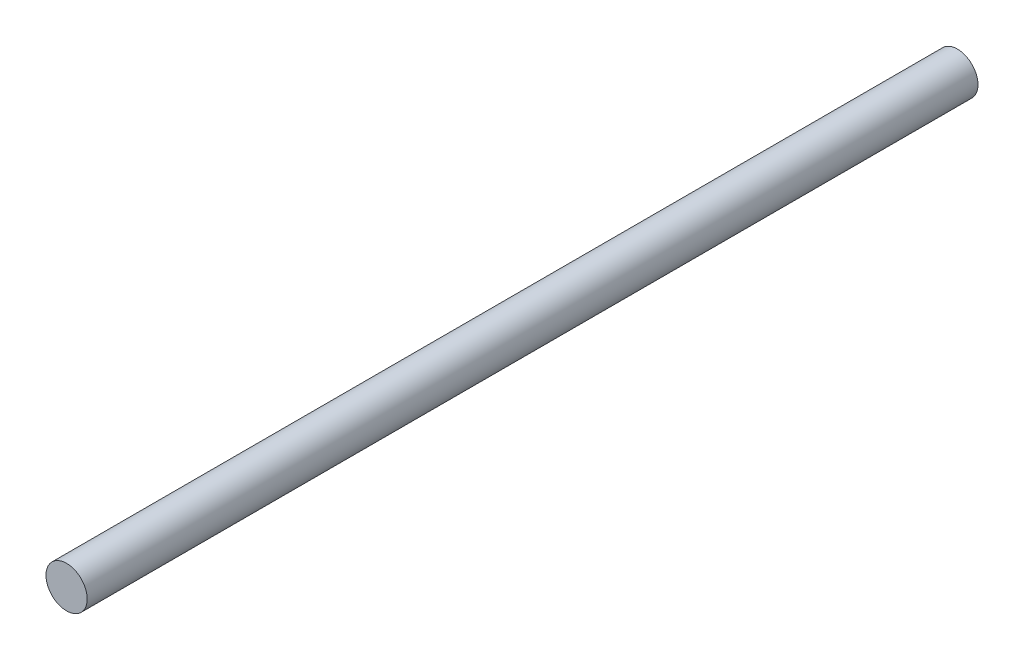
ISO-10303-21;
HEADER;
FILE_DESCRIPTION(('STEP AP214'),'2;1');
FILE_NAME('part.step','',(''),(''),'','','');
FILE_SCHEMA(('AUTOMOTIVE_DESIGN { 1 0 10303 214 1 1 1 1 }'));
ENDSEC;
DATA;
#1=APPLICATION_CONTEXT('core data for automotive mechanical design processes');
#2=APPLICATION_PROTOCOL_DEFINITION('international standard','automotive_design',2000,#1);
#3=PRODUCT_CONTEXT('',#1,'mechanical');
#4=PRODUCT('Part','Part','',(#3));
#5=PRODUCT_RELATED_PRODUCT_CATEGORY('part','',(#4));
#6=PRODUCT_DEFINITION_FORMATION('','',#4);
#7=PRODUCT_DEFINITION_CONTEXT('part definition',#1,'design');
#8=PRODUCT_DEFINITION('design','',#6,#7);
#9=PRODUCT_DEFINITION_SHAPE('','',#8);
#10=(LENGTH_UNIT() NAMED_UNIT(*) SI_UNIT(.MILLI.,.METRE.));
#11=(NAMED_UNIT(*) PLANE_ANGLE_UNIT() SI_UNIT($,.RADIAN.));
#12=(NAMED_UNIT(*) SI_UNIT($,.STERADIAN.) SOLID_ANGLE_UNIT());
#13=UNCERTAINTY_MEASURE_WITH_UNIT(LENGTH_MEASURE(1.E-05),#10,'distance_accuracy_value','');
#14=(GEOMETRIC_REPRESENTATION_CONTEXT(3) GLOBAL_UNCERTAINTY_ASSIGNED_CONTEXT((#13)) GLOBAL_UNIT_ASSIGNED_CONTEXT((#10,
#11,#12)) REPRESENTATION_CONTEXT('',''));
#15=CARTESIAN_POINT('',(0.,0.,0.));
#16=DIRECTION('',(0.,0.,1.));
#17=DIRECTION('',(1.,0.,0.));
#18=AXIS2_PLACEMENT_3D('',#15,#16,#17);
#19=CARTESIAN_POINT('',(-1.42213638941993,0.651812511817468,54.));
#20=DIRECTION('',(0.,0.,-1.));
#21=DIRECTION('',(-1.,0.,0.));
#22=AXIS2_PLACEMENT_3D('',#19,#20,#21);
#23=CYLINDRICAL_SURFACE('',#22,1.25);
#24=CARTESIAN_POINT('',(-1.42213638941993,0.651812511817468,54.));
#25=DIRECTION('',(0.,0.,1.));
#26=DIRECTION('',(1.,0.,0.));
#27=AXIS2_PLACEMENT_3D('',#24,#25,#26);
#28=CIRCLE('',#27,1.25);
#29=CARTESIAN_POINT('',(-0.17213638941993,0.651812511817468,54.));
#30=VERTEX_POINT('',#29);
#31=EDGE_CURVE('E10',#30,#30,#28,.T.);
#32=ORIENTED_EDGE('',*,*,#31,.F.);
#33=EDGE_LOOP('',(#32));
#34=FACE_BOUND('',#33,.T.);
#35=CARTESIAN_POINT('',(-1.42213638941993,0.651812511817468,0.));
#36=DIRECTION('',(0.,0.,1.));
#37=DIRECTION('',(1.,0.,0.));
#38=AXIS2_PLACEMENT_3D('',#35,#36,#37);
#39=CIRCLE('',#38,1.25);
#40=CARTESIAN_POINT('',(-0.17213638941993,0.651812511817468,0.));
#41=VERTEX_POINT('',#40);
#42=EDGE_CURVE('E34',#41,#41,#39,.T.);
#43=ORIENTED_EDGE('',*,*,#42,.T.);
#44=EDGE_LOOP('',(#43));
#45=FACE_BOUND('',#44,.T.);
#46=ADVANCED_FACE('F31',(#34,#45),#23,.T.);
#47=CARTESIAN_POINT('',(-1.42213638941993,0.651812511817468,54.));
#48=DIRECTION('',(0.,0.,1.));
#49=DIRECTION('',(1.,0.,0.));
#50=AXIS2_PLACEMENT_3D('',#47,#48,#49);
#51=PLANE('',#50);
#52=ORIENTED_EDGE('',*,*,#31,.T.);
#53=EDGE_LOOP('',(#52));
#54=FACE_BOUND('',#53,.T.);
#55=ADVANCED_FACE('F46',(#54),#51,.T.);
#56=CARTESIAN_POINT('',(-1.42213638941993,0.651812511817468,0.));
#57=DIRECTION('',(0.,0.,1.));
#58=DIRECTION('',(1.,0.,0.));
#59=AXIS2_PLACEMENT_3D('',#56,#57,#58);
#60=PLANE('',#59);
#61=ORIENTED_EDGE('',*,*,#42,.F.);
#62=EDGE_LOOP('',(#61));
#63=FACE_BOUND('',#62,.T.);
#64=ADVANCED_FACE('F44',(#63),#60,.F.);
#65=CLOSED_SHELL('',(#46,#55,#64));
#66=MANIFOLD_SOLID_BREP('B2',#65);
#67=ADVANCED_BREP_SHAPE_REPRESENTATION('',(#18,#66),#14);
#68=SHAPE_DEFINITION_REPRESENTATION(#9,#67);
ENDSEC;
END-ISO-10303-21;
